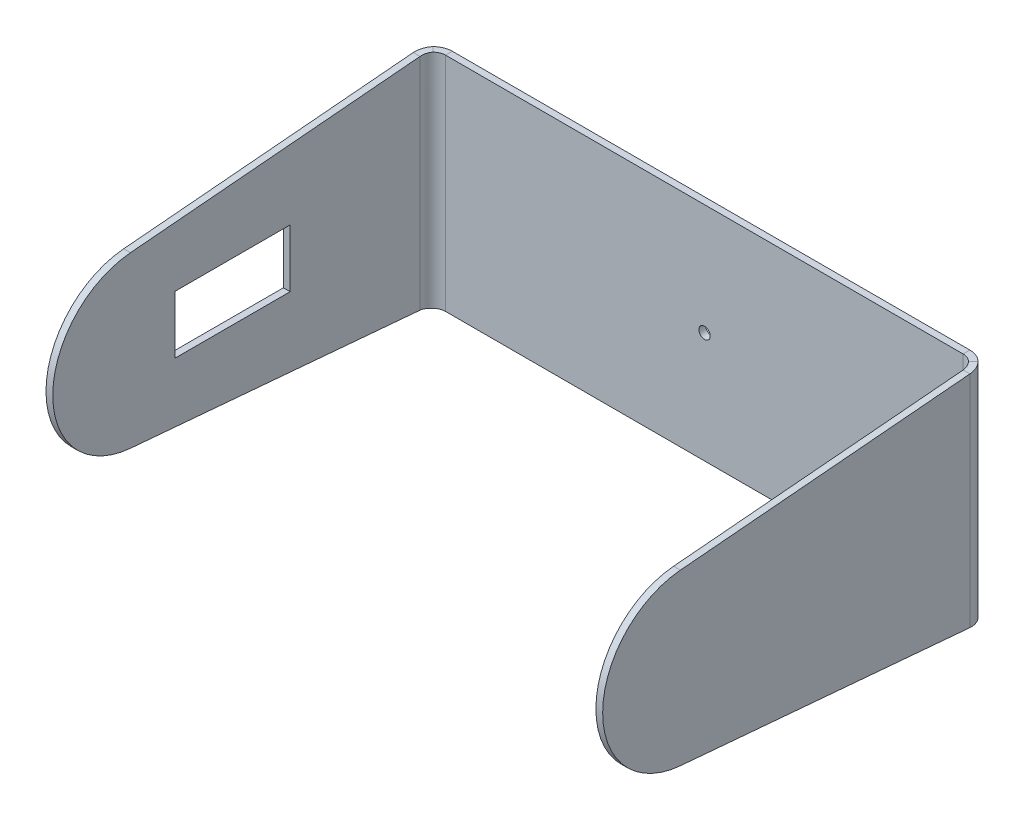
ISO-10303-21;
HEADER;
FILE_DESCRIPTION(('STEP AP214'),'2;1');
FILE_NAME('part.step','',(''),(''),'','','');
FILE_SCHEMA(('AUTOMOTIVE_DESIGN { 1 0 10303 214 1 1 1 1 }'));
ENDSEC;
DATA;
#1=APPLICATION_CONTEXT('core data for automotive mechanical design processes');
#2=APPLICATION_PROTOCOL_DEFINITION('international standard','automotive_design',2000,#1);
#3=PRODUCT_CONTEXT('',#1,'mechanical');
#4=PRODUCT('Part','Part','',(#3));
#5=PRODUCT_RELATED_PRODUCT_CATEGORY('part','',(#4));
#6=PRODUCT_DEFINITION_FORMATION('','',#4);
#7=PRODUCT_DEFINITION_CONTEXT('part definition',#1,'design');
#8=PRODUCT_DEFINITION('design','',#6,#7);
#9=PRODUCT_DEFINITION_SHAPE('','',#8);
#10=(LENGTH_UNIT() NAMED_UNIT(*) SI_UNIT(.MILLI.,.METRE.));
#11=(NAMED_UNIT(*) PLANE_ANGLE_UNIT() SI_UNIT($,.RADIAN.));
#12=(NAMED_UNIT(*) SI_UNIT($,.STERADIAN.) SOLID_ANGLE_UNIT());
#13=UNCERTAINTY_MEASURE_WITH_UNIT(LENGTH_MEASURE(1.E-05),#10,'distance_accuracy_value','');
#14=(GEOMETRIC_REPRESENTATION_CONTEXT(3) GLOBAL_UNCERTAINTY_ASSIGNED_CONTEXT((#13)) GLOBAL_UNIT_ASSIGNED_CONTEXT((#10,
#11,#12)) REPRESENTATION_CONTEXT('',''));
#15=CARTESIAN_POINT('',(0.,0.,0.));
#16=DIRECTION('',(0.,0.,1.));
#17=DIRECTION('',(1.,0.,0.));
#18=AXIS2_PLACEMENT_3D('',#15,#16,#17);
#19=CARTESIAN_POINT('',(-40.82194116274,0.,1.3462));
#20=DIRECTION('',(0.,-1.,0.));
#21=DIRECTION('',(1.,0.,0.));
#22=AXIS2_PLACEMENT_3D('',#19,#20,#21);
#23=PLANE('',#22);
#24=DIRECTION('',(1.,0.,0.));
#25=VECTOR('',#24,1.);
#26=CARTESIAN_POINT('',(125.762192998747,0.,0.));
#27=LINE('',#26,#25);
#28=CARTESIAN_POINT('',(-38.2983783239276,0.,0.));
#29=VERTEX_POINT('',#28);
#30=CARTESIAN_POINT('',(64.6044959984477,0.,0.));
#31=VERTEX_POINT('',#30);
#32=EDGE_CURVE('E97',#29,#31,#27,.T.);
#33=ORIENTED_EDGE('',*,*,#32,.T.);
#34=DIRECTION('',(0.,0.,1.));
#35=VECTOR('',#34,1.);
#36=CARTESIAN_POINT('',(64.6044959984477,0.,1.3462));
#37=LINE('',#36,#35);
#38=CARTESIAN_POINT('',(64.6044959984477,0.,1.3462));
#39=VERTEX_POINT('',#38);
#40=EDGE_CURVE('E822',#31,#39,#37,.T.);
#41=ORIENTED_EDGE('',*,*,#40,.T.);
#42=DIRECTION('',(1.,0.,0.));
#43=VECTOR('',#42,1.);
#44=CARTESIAN_POINT('',(-40.82194116274,0.,1.3462));
#45=LINE('',#44,#43);
#46=CARTESIAN_POINT('',(-38.2983783239276,0.,1.3462));
#47=VERTEX_POINT('',#46);
#48=EDGE_CURVE('E748',#47,#39,#45,.T.);
#49=ORIENTED_EDGE('',*,*,#48,.F.);
#50=DIRECTION('',(0.,0.,1.));
#51=VECTOR('',#50,1.);
#52=CARTESIAN_POINT('',(-38.2983783239276,0.,1.3462));
#53=LINE('',#52,#51);
#54=EDGE_CURVE('E673',#29,#47,#53,.T.);
#55=ORIENTED_EDGE('',*,*,#54,.F.);
#56=EDGE_LOOP('',(#33,#41,#49,#55));
#57=FACE_BOUND('',#56,.T.);
#58=ADVANCED_FACE('F70',(#57),#23,.T.);
#59=CARTESIAN_POINT('',(67.1280588372601,44.1331519853289,1.3462));
#60=DIRECTION('',(0.,1.,0.));
#61=DIRECTION('',(-1.,0.,0.));
#62=AXIS2_PLACEMENT_3D('',#59,#60,#61);
#63=PLANE('',#62);
#64=DIRECTION('',(-1.,0.,0.));
#65=VECTOR('',#64,1.);
#66=CARTESIAN_POINT('',(67.1280588372601,44.1331519853289,1.3462));
#67=LINE('',#66,#65);
#68=CARTESIAN_POINT('',(64.6044959984477,44.1331519853289,1.3462));
#69=VERTEX_POINT('',#68);
#70=CARTESIAN_POINT('',(-38.2983783239276,44.1331519853289,1.3462));
#71=VERTEX_POINT('',#70);
#72=EDGE_CURVE('E751',#69,#71,#67,.T.);
#73=ORIENTED_EDGE('',*,*,#72,.F.);
#74=DIRECTION('',(0.,0.,-1.));
#75=VECTOR('',#74,1.);
#76=CARTESIAN_POINT('',(64.6044959984477,44.1331519853289,1.3462));
#77=LINE('',#76,#75);
#78=CARTESIAN_POINT('',(64.6044959984477,44.1331519853289,0.));
#79=VERTEX_POINT('',#78);
#80=EDGE_CURVE('E12',#69,#79,#77,.T.);
#81=ORIENTED_EDGE('',*,*,#80,.T.);
#82=DIRECTION('',(1.,0.,0.));
#83=VECTOR('',#82,1.);
#84=CARTESIAN_POINT('',(125.762192998747,44.1331519853289,0.));
#85=LINE('',#84,#83);
#86=CARTESIAN_POINT('',(-38.2983783239276,44.1331519853289,0.));
#87=VERTEX_POINT('',#86);
#88=EDGE_CURVE('E749',#79,#87,#85,.F.);
#89=ORIENTED_EDGE('',*,*,#88,.T.);
#90=DIRECTION('',(0.,0.,-1.));
#91=VECTOR('',#90,1.);
#92=CARTESIAN_POINT('',(-38.2983783239276,44.1331519853289,1.3462));
#93=LINE('',#92,#91);
#94=EDGE_CURVE('E670',#71,#87,#93,.T.);
#95=ORIENTED_EDGE('',*,*,#94,.F.);
#96=EDGE_LOOP('',(#73,#81,#89,#95));
#97=FACE_BOUND('',#96,.T.);
#98=ADVANCED_FACE('F808',(#97),#63,.T.);
#99=CARTESIAN_POINT('',(125.762192998747,22.0665759926644,1.3462));
#100=DIRECTION('',(0.,0.,1.));
#101=DIRECTION('',(1.,0.,0.));
#102=AXIS2_PLACEMENT_3D('',#99,#100,#101);
#103=PLANE('',#102);
#104=CARTESIAN_POINT('',(13.1919740673823,22.0665759926644,1.3462));
#105=DIRECTION('',(0.,0.,1.));
#106=DIRECTION('',(1.,0.,0.));
#107=AXIS2_PLACEMENT_3D('',#104,#105,#106);
#108=CIRCLE('',#107,1.13402350588102);
#109=CARTESIAN_POINT('',(14.3259975732633,22.0665759926644,1.3462));
#110=VERTEX_POINT('',#109);
#111=EDGE_CURVE('E744',#110,#110,#108,.T.);
#112=ORIENTED_EDGE('',*,*,#111,.F.);
#113=EDGE_LOOP('',(#112));
#114=FACE_BOUND('',#113,.T.);
#115=ORIENTED_EDGE('',*,*,#48,.T.);
#116=DIRECTION('',(0.,1.,0.));
#117=VECTOR('',#116,1.);
#118=CARTESIAN_POINT('',(64.6044959984477,22.0665759926645,1.3462));
#119=LINE('',#118,#117);
#120=EDGE_CURVE('E473',#39,#69,#119,.T.);
#121=ORIENTED_EDGE('',*,*,#120,.T.);
#122=ORIENTED_EDGE('',*,*,#72,.T.);
#123=DIRECTION('',(0.,1.,0.));
#124=VECTOR('',#123,1.);
#125=CARTESIAN_POINT('',(-38.2983783239276,22.0665759926645,1.3462));
#126=LINE('',#125,#124);
#127=EDGE_CURVE('E742',#47,#71,#126,.T.);
#128=ORIENTED_EDGE('',*,*,#127,.F.);
#129=EDGE_LOOP('',(#115,#121,#122,#128));
#130=FACE_BOUND('',#129,.T.);
#131=ADVANCED_FACE('F813',(#114,#130),#103,.T.);
#132=CARTESIAN_POINT('',(125.762192998747,22.0665759926644,0.));
#133=DIRECTION('',(0.,0.,1.));
#134=DIRECTION('',(1.,0.,0.));
#135=AXIS2_PLACEMENT_3D('',#132,#133,#134);
#136=PLANE('',#135);
#137=DIRECTION('',(0.,1.,0.));
#138=VECTOR('',#137,1.);
#139=CARTESIAN_POINT('',(64.6044959984477,22.0665759926645,0.));
#140=LINE('',#139,#138);
#141=EDGE_CURVE('E81',#31,#79,#140,.T.);
#142=ORIENTED_EDGE('',*,*,#141,.F.);
#143=ORIENTED_EDGE('',*,*,#32,.F.);
#144=DIRECTION('',(0.,1.,0.));
#145=VECTOR('',#144,1.);
#146=CARTESIAN_POINT('',(-38.2983783239276,22.0665759926645,0.));
#147=LINE('',#146,#145);
#148=EDGE_CURVE('E671',#29,#87,#147,.T.);
#149=ORIENTED_EDGE('',*,*,#148,.T.);
#150=ORIENTED_EDGE('',*,*,#88,.F.);
#151=EDGE_LOOP('',(#142,#143,#149,#150));
#152=FACE_BOUND('',#151,.T.);
#153=CARTESIAN_POINT('',(13.1919740673823,22.0665759926644,0.));
#154=DIRECTION('',(0.,0.,1.));
#155=DIRECTION('',(1.,0.,0.));
#156=AXIS2_PLACEMENT_3D('',#153,#154,#155);
#157=CIRCLE('',#156,1.13402350588102);
#158=CARTESIAN_POINT('',(14.3259975732633,22.0665759926644,0.));
#159=VERTEX_POINT('',#158);
#160=EDGE_CURVE('E745',#159,#159,#157,.T.);
#161=ORIENTED_EDGE('',*,*,#160,.T.);
#162=EDGE_LOOP('',(#161));
#163=FACE_BOUND('',#162,.T.);
#164=ADVANCED_FACE('F72',(#152,#163),#136,.F.);
#165=CARTESIAN_POINT('',(13.1919740673823,22.0665759926644,1.3462));
#166=DIRECTION('',(0.,0.,1.));
#167=DIRECTION('',(1.,0.,0.));
#168=AXIS2_PLACEMENT_3D('',#165,#166,#167);
#169=CYLINDRICAL_SURFACE('',#168,1.13402350588102);
#170=ORIENTED_EDGE('',*,*,#111,.T.);
#171=EDGE_LOOP('',(#170));
#172=FACE_BOUND('',#171,.T.);
#173=ORIENTED_EDGE('',*,*,#160,.F.);
#174=EDGE_LOOP('',(#173));
#175=FACE_BOUND('',#174,.T.);
#176=ADVANCED_FACE('F567',(#172,#175),#169,.F.);
#177=CARTESIAN_POINT('',(-42.1845783239276,0.219391616614232,3.88620000000002));
#178=CARTESIAN_POINT('',(-42.1845783239276,0.18281978844676,3.37740636334999));
#179=CARTESIAN_POINT('',(-42.083430939996,0.146261077742817,2.86899537180298));
#180=CARTESIAN_POINT('',(-41.6940869863499,0.0731305388714022,1.92903591848262));
#181=CARTESIAN_POINT('',(-41.4061081276746,0.0365718281674734,1.49801305765265));
#182=CARTESIAN_POINT('',(-41.0463366969748,0.,1.13824162695285));
#183=CARTESIAN_POINT('',(-40.8383783239276,0.219391616614232,3.88620000000001));
#184=CARTESIAN_POINT('',(-40.8383783239276,0.1828198333425,3.553655547678));
#185=CARTESIAN_POINT('',(-40.7722689226651,0.146261077742817,3.22136037372744));
#186=CARTESIAN_POINT('',(-40.5177957503474,0.0731305388714022,2.60700778985792));
#187=CARTESIAN_POINT('',(-40.3295739854243,0.0365717832717318,2.32529321306903));
#188=CARTESIAN_POINT('',(-40.0944295481414,0.,2.09014877578618));
#189=B_SPLINE_SURFACE_WITH_KNOTS('',1,3,((#177,#178,#179,#180,#181,#182),(#183,#184,#185,#186,
#187,#188)),.UNSPECIFIED.,.F.,.F.,.F.,(2,2),(4,2,4),(0.,1.),(0.,0.5,1.),.UNSPECIFIED.);
#190=CARTESIAN_POINT('',(-40.8383783239276,0.219391616614232,3.88620000000001));
#191=CARTESIAN_POINT('',(-42.1845783239276,0.219391616614232,3.88620000000002));
#192=B_SPLINE_CURVE_WITH_KNOTS('',1,(#190,#191),.UNSPECIFIED.,.F.,.F.,(2,2),(0.,1.),.UNSPECIFIED.);
#193=CARTESIAN_POINT('',(-42.1845783239276,0.219391616614234,3.88620000000002));
#194=VERTEX_POINT('',#193);
#195=CARTESIAN_POINT('',(-40.8383783239276,0.219391616614232,3.88620000000001));
#196=VERTEX_POINT('',#195);
#197=EDGE_CURVE('E462',#194,#196,#192,.F.);
#198=CARTESIAN_POINT('',(-42.1845783239276,0.219391616614232,3.88620000000002));
#199=CARTESIAN_POINT('',(-42.1845783239276,0.18281978844676,3.37740636334999));
#200=CARTESIAN_POINT('',(-42.083430939996,0.146261077742817,2.86899537180298));
#201=CARTESIAN_POINT('',(-41.6940869863499,0.0731305388714022,1.92903591848262));
#202=CARTESIAN_POINT('',(-41.4061081276746,0.0365718281674734,1.49801305765265));
#203=CARTESIAN_POINT('',(-41.0463366969748,0.,1.13824162695285));
#204=B_SPLINE_CURVE_WITH_KNOTS('',3,(#198,#199,#200,#201,#202,#203),.UNSPECIFIED.,.F.,.F.,(4,2,
4),(0.,0.5,1.),.UNSPECIFIED.);
#205=CARTESIAN_POINT('',(-41.0463366969748,0.,1.13824162695285));
#206=VERTEX_POINT('',#205);
#207=EDGE_CURVE('E632',#194,#206,#204,.T.);
#208=CARTESIAN_POINT('',(-41.0463366969748,0.,1.13824162695285));
#209=CARTESIAN_POINT('',(-40.0944295481414,0.,2.09014877578618));
#210=B_SPLINE_CURVE_WITH_KNOTS('',1,(#208,#209),.UNSPECIFIED.,.F.,.F.,(2,2),(0.,1.),.UNSPECIFIED.);
#211=CARTESIAN_POINT('',(-40.0944295481414,0.,2.09014877578618));
#212=VERTEX_POINT('',#211);
#213=EDGE_CURVE('E667',#206,#212,#210,.T.);
#214=CARTESIAN_POINT('',(-40.0944295481414,0.,2.09014877578618));
#215=CARTESIAN_POINT('',(-40.3295739854243,0.0365717832717318,2.32529321306903));
#216=CARTESIAN_POINT('',(-40.5177957503474,0.0731305388714022,2.60700778985792));
#217=CARTESIAN_POINT('',(-40.7722689226651,0.146261077742817,3.22136037372744));
#218=CARTESIAN_POINT('',(-40.8383783239276,0.1828198333425,3.553655547678));
#219=CARTESIAN_POINT('',(-40.8383783239276,0.219391616614232,3.88620000000001));
#220=B_SPLINE_CURVE_WITH_KNOTS('',3,(#214,#215,#216,#217,#218,#219),.UNSPECIFIED.,.F.,.F.,(4,2,
4),(0.,0.5,1.),.UNSPECIFIED.);
#221=EDGE_CURVE('E634',#196,#212,#220,.F.);
#222=ORIENTED_EDGE('',*,*,#197,.F.);
#223=ORIENTED_EDGE('',*,*,#207,.T.);
#224=ORIENTED_EDGE('',*,*,#213,.T.);
#225=ORIENTED_EDGE('',*,*,#221,.F.);
#226=EDGE_LOOP('',(#222,#223,#224,#225));
#227=FACE_BOUND('',#226,.T.);
#228=ADVANCED_FACE('F562',(#227),#189,.F.);
#229=CARTESIAN_POINT('',(-38.2983783239276,0.,3.8862));
#230=DIRECTION('',(0.,1.,0.));
#231=DIRECTION('',(-1.,0.,0.));
#232=AXIS2_PLACEMENT_3D('',#229,#230,#231);
#233=PLANE('',#232);
#234=ORIENTED_EDGE('',*,*,#213,.F.);
#235=CARTESIAN_POINT('',(-38.2983783239276,0.,3.8862));
#236=DIRECTION('',(0.,-1.,0.));
#237=DIRECTION('',(1.,0.,0.));
#238=AXIS2_PLACEMENT_3D('',#235,#236,#237);
#239=CIRCLE('',#238,3.8862);
#240=EDGE_CURVE('E540',#206,#29,#239,.T.);
#241=ORIENTED_EDGE('',*,*,#240,.T.);
#242=ORIENTED_EDGE('',*,*,#54,.T.);
#243=CARTESIAN_POINT('',(-38.2983783239276,0.,3.8862));
#244=DIRECTION('',(0.,-1.,0.));
#245=DIRECTION('',(1.,0.,0.));
#246=AXIS2_PLACEMENT_3D('',#243,#244,#245);
#247=CIRCLE('',#246,2.54);
#248=EDGE_CURVE('E520',#212,#47,#247,.T.);
#249=ORIENTED_EDGE('',*,*,#248,.F.);
#250=EDGE_LOOP('',(#234,#241,#242,#249));
#251=FACE_BOUND('',#250,.T.);
#252=ADVANCED_FACE('F606',(#251),#233,.F.);
#253=CARTESIAN_POINT('',(-38.2983783239276,44.1331519853289,3.8862));
#254=DIRECTION('',(0.,-1.,0.));
#255=DIRECTION('',(0.,0.,-1.));
#256=AXIS2_PLACEMENT_3D('',#253,#254,#255);
#257=PLANE('',#256);
#258=ORIENTED_EDGE('',*,*,#94,.T.);
#259=CARTESIAN_POINT('',(-38.2983783239276,44.1331519853289,3.8862));
#260=DIRECTION('',(0.,-1.,0.));
#261=DIRECTION('',(1.,0.,0.));
#262=AXIS2_PLACEMENT_3D('',#259,#260,#261);
#263=CIRCLE('',#262,3.8862);
#264=CARTESIAN_POINT('',(-41.0463366969748,44.1331519853289,1.13824162695284));
#265=VERTEX_POINT('',#264);
#266=EDGE_CURVE('E532',#87,#265,#263,.F.);
#267=ORIENTED_EDGE('',*,*,#266,.T.);
#268=CARTESIAN_POINT('',(-40.0944295481414,44.1331519853289,2.09014877578618));
#269=CARTESIAN_POINT('',(-41.0463366969748,44.1331519853289,1.13824162695286));
#270=B_SPLINE_CURVE_WITH_KNOTS('',1,(#268,#269),.UNSPECIFIED.,.F.,.F.,(2,2),(0.,1.),.UNSPECIFIED.);
#271=CARTESIAN_POINT('',(-40.0944295481414,44.1331519853289,2.09014877578617));
#272=VERTEX_POINT('',#271);
#273=EDGE_CURVE('E595',#265,#272,#270,.F.);
#274=ORIENTED_EDGE('',*,*,#273,.T.);
#275=CARTESIAN_POINT('',(-38.2983783239276,44.1331519853289,3.8862));
#276=DIRECTION('',(0.,1.,0.));
#277=DIRECTION('',(0.,0.,1.));
#278=AXIS2_PLACEMENT_3D('',#275,#276,#277);
#279=CIRCLE('',#278,2.54);
#280=EDGE_CURVE('E518',#71,#272,#279,.T.);
#281=ORIENTED_EDGE('',*,*,#280,.F.);
#282=EDGE_LOOP('',(#258,#267,#274,#281));
#283=FACE_BOUND('',#282,.T.);
#284=ADVANCED_FACE('F561',(#283),#257,.F.);
#285=CARTESIAN_POINT('',(-41.0463366969748,44.1331519853289,1.13824162695286));
#286=CARTESIAN_POINT('',(-41.4061081276746,44.0965801571614,1.49801305765268));
#287=CARTESIAN_POINT('',(-41.6940869863499,44.0600214464575,1.92903591848264));
#288=CARTESIAN_POINT('',(-42.083430939996,43.986890907586,2.86899537180299));
#289=CARTESIAN_POINT('',(-42.1845783239276,43.9503321968821,3.37740636334999));
#290=CARTESIAN_POINT('',(-42.1845783239276,43.9137603687146,3.88620000000003));
#291=CARTESIAN_POINT('',(-40.0944295481414,44.1331519853289,2.09014877578618));
#292=CARTESIAN_POINT('',(-40.3295739854243,44.0965802020571,2.32529321306905));
#293=CARTESIAN_POINT('',(-40.5177957503474,44.0600214464575,2.60700778985793));
#294=CARTESIAN_POINT('',(-40.7722689226651,43.986890907586,3.22136037372745));
#295=CARTESIAN_POINT('',(-40.8383783239276,43.9503321519864,3.553655547678));
#296=CARTESIAN_POINT('',(-40.8383783239276,43.9137603687146,3.88620000000002));
#297=B_SPLINE_SURFACE_WITH_KNOTS('',1,3,((#285,#286,#287,#288,#289,#290),(#291,#292,#293,#294,
#295,#296)),.UNSPECIFIED.,.F.,.F.,.F.,(2,2),(4,2,4),(0.,1.),(0.,0.5,1.),.UNSPECIFIED.);
#298=CARTESIAN_POINT('',(-41.0463366969748,44.1331519853289,1.13824162695286));
#299=CARTESIAN_POINT('',(-41.4061081276746,44.0965801571614,1.49801305765268));
#300=CARTESIAN_POINT('',(-41.6940869863499,44.0600214464575,1.92903591848264));
#301=CARTESIAN_POINT('',(-42.083430939996,43.986890907586,2.86899537180299));
#302=CARTESIAN_POINT('',(-42.1845783239276,43.9503321968821,3.37740636334999));
#303=CARTESIAN_POINT('',(-42.1845783239276,43.9137603687146,3.88620000000003));
#304=B_SPLINE_CURVE_WITH_KNOTS('',3,(#298,#299,#300,#301,#302,#303),.UNSPECIFIED.,.F.,.F.,(4,2,
4),(0.,0.5,1.),.UNSPECIFIED.);
#305=CARTESIAN_POINT('',(-42.1845783239276,43.9137603687146,3.88620000000001));
#306=VERTEX_POINT('',#305);
#307=EDGE_CURVE('E528',#265,#306,#304,.T.);
#308=CARTESIAN_POINT('',(-42.1845783239276,43.9137603687146,3.88620000000003));
#309=CARTESIAN_POINT('',(-40.8383783239276,43.9137603687146,3.88620000000002));
#310=B_SPLINE_CURVE_WITH_KNOTS('',1,(#308,#309),.UNSPECIFIED.,.F.,.F.,(2,2),(0.,1.),.UNSPECIFIED.);
#311=CARTESIAN_POINT('',(-40.8383783239276,43.9137603687146,3.88620000000001));
#312=VERTEX_POINT('',#311);
#313=EDGE_CURVE('E457',#312,#306,#310,.F.);
#314=CARTESIAN_POINT('',(-40.8383783239276,43.9137603687146,3.88620000000002));
#315=CARTESIAN_POINT('',(-40.8383783239276,43.9503321519864,3.553655547678));
#316=CARTESIAN_POINT('',(-40.7722689226651,43.986890907586,3.22136037372745));
#317=CARTESIAN_POINT('',(-40.5177957503474,44.0600214464575,2.60700778985793));
#318=CARTESIAN_POINT('',(-40.3295739854243,44.0965802020571,2.32529321306905));
#319=CARTESIAN_POINT('',(-40.0944295481414,44.1331519853289,2.09014877578618));
#320=B_SPLINE_CURVE_WITH_KNOTS('',3,(#314,#315,#316,#317,#318,#319),.UNSPECIFIED.,.F.,.F.,(4,2,
4),(0.,0.5,1.),.UNSPECIFIED.);
#321=EDGE_CURVE('E517',#272,#312,#320,.F.);
#322=ORIENTED_EDGE('',*,*,#307,.T.);
#323=ORIENTED_EDGE('',*,*,#313,.F.);
#324=ORIENTED_EDGE('',*,*,#321,.F.);
#325=ORIENTED_EDGE('',*,*,#273,.F.);
#326=EDGE_LOOP('',(#322,#323,#324,#325));
#327=FACE_BOUND('',#326,.T.);
#328=ADVANCED_FACE('F488',(#327),#297,.F.);
#329=CARTESIAN_POINT('',(-38.2983783239276,66.5077825042554,3.8862));
#330=DIRECTION('',(0.,-1.,0.));
#331=DIRECTION('',(1.,0.,0.));
#332=AXIS2_PLACEMENT_3D('',#329,#330,#331);
#333=CYLINDRICAL_SURFACE('',#332,2.54);
#334=ORIENTED_EDGE('',*,*,#280,.T.);
#335=ORIENTED_EDGE('',*,*,#321,.T.);
#336=DIRECTION('',(0.,1.,0.));
#337=VECTOR('',#336,1.);
#338=CARTESIAN_POINT('',(-40.8383783239276,22.0665759926645,3.88620000000001));
#339=LINE('',#338,#337);
#340=EDGE_CURVE('E728',#196,#312,#339,.T.);
#341=ORIENTED_EDGE('',*,*,#340,.F.);
#342=ORIENTED_EDGE('',*,*,#221,.T.);
#343=ORIENTED_EDGE('',*,*,#248,.T.);
#344=ORIENTED_EDGE('',*,*,#127,.T.);
#345=EDGE_LOOP('',(#334,#335,#341,#342,#343,#344));
#346=FACE_BOUND('',#345,.T.);
#347=ADVANCED_FACE('F484',(#346),#333,.F.);
#348=CARTESIAN_POINT('',(-38.2983783239276,66.5077825042554,3.8862));
#349=DIRECTION('',(0.,-1.,0.));
#350=DIRECTION('',(1.,0.,0.));
#351=AXIS2_PLACEMENT_3D('',#348,#349,#350);
#352=CYLINDRICAL_SURFACE('',#351,3.8862);
#353=ORIENTED_EDGE('',*,*,#266,.F.);
#354=ORIENTED_EDGE('',*,*,#148,.F.);
#355=ORIENTED_EDGE('',*,*,#240,.F.);
#356=ORIENTED_EDGE('',*,*,#207,.F.);
#357=DIRECTION('',(0.,1.,0.));
#358=VECTOR('',#357,1.);
#359=CARTESIAN_POINT('',(-42.1845783239276,22.0665759926645,3.88620000000002));
#360=LINE('',#359,#358);
#361=EDGE_CURVE('E443',#194,#306,#360,.T.);
#362=ORIENTED_EDGE('',*,*,#361,.T.);
#363=ORIENTED_EDGE('',*,*,#307,.F.);
#364=EDGE_LOOP('',(#353,#354,#355,#356,#362,#363));
#365=FACE_BOUND('',#364,.T.);
#366=ADVANCED_FACE('F408',(#365),#352,.T.);
#367=CARTESIAN_POINT('',(-40.8383783239274,22.0665759926644,59.9967713226751));
#368=DIRECTION('',(1.,0.,0.));
#369=DIRECTION('',(0.,0.,-1.));
#370=AXIS2_PLACEMENT_3D('',#367,#368,#369);
#371=CYLINDRICAL_SURFACE('',#370,16.9053198700096);
#372=DIRECTION('',(1.,0.,0.));
#373=VECTOR('',#372,1.);
#374=CARTESIAN_POINT('',(-40.8383783239274,38.9083698103987,61.4609505836502));
#375=LINE('',#374,#373);
#376=CARTESIAN_POINT('',(-42.1845783239274,38.9083698103987,61.4609505836502));
#377=VERTEX_POINT('',#376);
#378=CARTESIAN_POINT('',(-40.8383783239274,38.9083698103987,61.4609505836502));
#379=VERTEX_POINT('',#378);
#380=EDGE_CURVE('E456',#377,#379,#375,.T.);
#381=ORIENTED_EDGE('',*,*,#380,.F.);
#382=CARTESIAN_POINT('',(-42.1845783239274,22.0665759926644,59.9967713226751));
#383=DIRECTION('',(1.,0.,0.));
#384=DIRECTION('',(0.,0.,-1.));
#385=AXIS2_PLACEMENT_3D('',#382,#383,#384);
#386=CIRCLE('',#385,16.9053198700096);
#387=CARTESIAN_POINT('',(-42.1845783239274,5.22478217493017,61.4609505836502));
#388=VERTEX_POINT('',#387);
#389=EDGE_CURVE('E451',#377,#388,#386,.T.);
#390=ORIENTED_EDGE('',*,*,#389,.T.);
#391=DIRECTION('',(1.,0.,0.));
#392=VECTOR('',#391,1.);
#393=CARTESIAN_POINT('',(-40.8383783239274,5.22478217493017,61.4609505836502));
#394=LINE('',#393,#392);
#395=CARTESIAN_POINT('',(-40.8383783239274,5.22478217493017,61.4609505836502));
#396=VERTEX_POINT('',#395);
#397=EDGE_CURVE('E681',#388,#396,#394,.T.);
#398=ORIENTED_EDGE('',*,*,#397,.T.);
#399=CARTESIAN_POINT('',(-40.8383783239274,22.0665759926644,59.9967713226751));
#400=DIRECTION('',(1.,0.,0.));
#401=DIRECTION('',(0.,0.,-1.));
#402=AXIS2_PLACEMENT_3D('',#399,#400,#401);
#403=CIRCLE('',#402,16.9053198700096);
#404=EDGE_CURVE('E704',#379,#396,#403,.T.);
#405=ORIENTED_EDGE('',*,*,#404,.F.);
#406=EDGE_LOOP('',(#381,#390,#398,#405));
#407=FACE_BOUND('',#406,.T.);
#408=ADVANCED_FACE('F404',(#407),#371,.T.);
#409=CARTESIAN_POINT('',(-40.8383783239274,16.3134759926644,52.5594085617072));
#410=DIRECTION('',(0.,-1.,0.));
#411=DIRECTION('',(0.,0.,-1.));
#412=AXIS2_PLACEMENT_3D('',#409,#410,#411);
#413=PLANE('',#412);
#414=DIRECTION('',(1.,0.,0.));
#415=VECTOR('',#414,1.);
#416=CARTESIAN_POINT('',(-40.8383783239275,16.3134759926644,29.6994085617072));
#417=LINE('',#416,#415);
#418=CARTESIAN_POINT('',(-42.1845783239275,16.3134759926644,29.6994085617072));
#419=VERTEX_POINT('',#418);
#420=CARTESIAN_POINT('',(-40.8383783239275,16.3134759926644,29.6994085617072));
#421=VERTEX_POINT('',#420);
#422=EDGE_CURVE('E688',#419,#421,#417,.T.);
#423=ORIENTED_EDGE('',*,*,#422,.F.);
#424=DIRECTION('',(0.,0.,-1.));
#425=VECTOR('',#424,1.);
#426=CARTESIAN_POINT('',(-42.1845783239282,16.3134759926645,-165.2214970003));
#427=LINE('',#426,#425);
#428=CARTESIAN_POINT('',(-42.1845783239274,16.3134759926644,52.5594085617072));
#429=VERTEX_POINT('',#428);
#430=EDGE_CURVE('E713',#429,#419,#427,.T.);
#431=ORIENTED_EDGE('',*,*,#430,.F.);
#432=DIRECTION('',(1.,0.,0.));
#433=VECTOR('',#432,1.);
#434=CARTESIAN_POINT('',(-40.8383783239274,16.3134759926644,52.5594085617072));
#435=LINE('',#434,#433);
#436=CARTESIAN_POINT('',(-40.8383783239274,16.3134759926644,52.5594085617072));
#437=VERTEX_POINT('',#436);
#438=EDGE_CURVE('E683',#429,#437,#435,.T.);
#439=ORIENTED_EDGE('',*,*,#438,.T.);
#440=DIRECTION('',(0.,0.,-1.));
#441=VECTOR('',#440,1.);
#442=CARTESIAN_POINT('',(-40.8383783239274,16.3134759926644,52.5594085617072));
#443=LINE('',#442,#441);
#444=EDGE_CURVE('E685',#437,#421,#443,.T.);
#445=ORIENTED_EDGE('',*,*,#444,.T.);
#446=EDGE_LOOP('',(#423,#431,#439,#445));
#447=FACE_BOUND('',#446,.T.);
#448=ADVANCED_FACE('F407',(#447),#413,.F.);
#449=CARTESIAN_POINT('',(-40.8383783239275,16.3134759926644,29.6994085617072));
#450=DIRECTION('',(0.,0.,-1.));
#451=DIRECTION('',(0.,1.,0.));
#452=AXIS2_PLACEMENT_3D('',#449,#450,#451);
#453=PLANE('',#452);
#454=DIRECTION('',(1.,0.,0.));
#455=VECTOR('',#454,1.);
#456=CARTESIAN_POINT('',(-40.8383783239275,27.8196759926644,29.6994085617072));
#457=LINE('',#456,#455);
#458=CARTESIAN_POINT('',(-42.1845783239275,27.8196759926644,29.6994085617072));
#459=VERTEX_POINT('',#458);
#460=CARTESIAN_POINT('',(-40.8383783239275,27.8196759926644,29.6994085617072));
#461=VERTEX_POINT('',#460);
#462=EDGE_CURVE('E693',#459,#461,#457,.T.);
#463=ORIENTED_EDGE('',*,*,#462,.F.);
#464=DIRECTION('',(0.,1.,0.));
#465=VECTOR('',#464,1.);
#466=CARTESIAN_POINT('',(-42.1845783239275,22.0665759926644,29.6994085617072));
#467=LINE('',#466,#465);
#468=EDGE_CURVE('E715',#419,#459,#467,.T.);
#469=ORIENTED_EDGE('',*,*,#468,.F.);
#470=ORIENTED_EDGE('',*,*,#422,.T.);
#471=DIRECTION('',(0.,1.,0.));
#472=VECTOR('',#471,1.);
#473=CARTESIAN_POINT('',(-40.8383783239275,16.3134759926644,29.6994085617072));
#474=LINE('',#473,#472);
#475=EDGE_CURVE('E690',#421,#461,#474,.T.);
#476=ORIENTED_EDGE('',*,*,#475,.T.);
#477=EDGE_LOOP('',(#463,#469,#470,#476));
#478=FACE_BOUND('',#477,.T.);
#479=ADVANCED_FACE('F412',(#478),#453,.F.);
#480=CARTESIAN_POINT('',(-40.8383783239275,27.8196759926644,29.6994085617072));
#481=DIRECTION('',(0.,1.,0.));
#482=DIRECTION('',(0.,0.,1.));
#483=AXIS2_PLACEMENT_3D('',#480,#481,#482);
#484=PLANE('',#483);
#485=DIRECTION('',(0.,0.,-1.));
#486=VECTOR('',#485,1.);
#487=CARTESIAN_POINT('',(-42.1845783239282,27.8196759926645,-165.2214970003));
#488=LINE('',#487,#486);
#489=CARTESIAN_POINT('',(-42.1845783239274,27.8196759926644,52.5594085617072));
#490=VERTEX_POINT('',#489);
#491=EDGE_CURVE('E394',#459,#490,#488,.F.);
#492=ORIENTED_EDGE('',*,*,#491,.F.);
#493=ORIENTED_EDGE('',*,*,#462,.T.);
#494=DIRECTION('',(0.,0.,1.));
#495=VECTOR('',#494,1.);
#496=CARTESIAN_POINT('',(-40.8383783239275,27.8196759926644,29.6994085617072));
#497=LINE('',#496,#495);
#498=CARTESIAN_POINT('',(-40.8383783239274,27.8196759926644,52.5594085617072));
#499=VERTEX_POINT('',#498);
#500=EDGE_CURVE('E695',#461,#499,#497,.T.);
#501=ORIENTED_EDGE('',*,*,#500,.T.);
#502=DIRECTION('',(1.,0.,0.));
#503=VECTOR('',#502,1.);
#504=CARTESIAN_POINT('',(-40.8383783239274,27.8196759926644,52.5594085617072));
#505=LINE('',#504,#503);
#506=EDGE_CURVE('E698',#490,#499,#505,.T.);
#507=ORIENTED_EDGE('',*,*,#506,.F.);
#508=EDGE_LOOP('',(#492,#493,#501,#507));
#509=FACE_BOUND('',#508,.T.);
#510=ADVANCED_FACE('F416',(#509),#484,.F.);
#511=CARTESIAN_POINT('',(-40.8383783239274,27.8196759926644,52.5594085617072));
#512=DIRECTION('',(0.,0.,1.));
#513=DIRECTION('',(0.,-1.,0.));
#514=AXIS2_PLACEMENT_3D('',#511,#512,#513);
#515=PLANE('',#514);
#516=ORIENTED_EDGE('',*,*,#438,.F.);
#517=DIRECTION('',(0.,1.,0.));
#518=VECTOR('',#517,1.);
#519=CARTESIAN_POINT('',(-42.1845783239274,22.0665759926644,52.5594085617072));
#520=LINE('',#519,#518);
#521=EDGE_CURVE('E710',#490,#429,#520,.F.);
#522=ORIENTED_EDGE('',*,*,#521,.F.);
#523=ORIENTED_EDGE('',*,*,#506,.T.);
#524=DIRECTION('',(0.,-1.,0.));
#525=VECTOR('',#524,1.);
#526=CARTESIAN_POINT('',(-40.8383783239274,27.8196759926644,52.5594085617072));
#527=LINE('',#526,#525);
#528=EDGE_CURVE('E700',#499,#437,#527,.T.);
#529=ORIENTED_EDGE('',*,*,#528,.T.);
#530=EDGE_LOOP('',(#516,#522,#523,#529));
#531=FACE_BOUND('',#530,.T.);
#532=ADVANCED_FACE('F420',(#531),#515,.F.);
#533=CARTESIAN_POINT('',(-40.8383783239282,22.0665759926645,-165.2214970003));
#534=DIRECTION('',(1.,0.,0.));
#535=DIRECTION('',(0.,0.,-1.));
#536=AXIS2_PLACEMENT_3D('',#533,#534,#535);
#537=PLANE('',#536);
#538=ORIENTED_EDGE('',*,*,#528,.F.);
#539=ORIENTED_EDGE('',*,*,#500,.F.);
#540=ORIENTED_EDGE('',*,*,#475,.F.);
#541=ORIENTED_EDGE('',*,*,#444,.F.);
#542=EDGE_LOOP('',(#538,#539,#540,#541));
#543=FACE_BOUND('',#542,.T.);
#544=DIRECTION('',(0.,-0.0866105623693356,-0.996242244881268));
#545=VECTOR('',#544,1.);
#546=CARTESIAN_POINT('',(-40.8383783239274,5.22478217493017,61.4609505836501));
#547=LINE('',#546,#545);
#548=EDGE_CURVE('E703',#396,#196,#547,.T.);
#549=ORIENTED_EDGE('',*,*,#548,.T.);
#550=ORIENTED_EDGE('',*,*,#340,.T.);
#551=DIRECTION('',(0.,-0.086610562369336,0.996242244881268));
#552=VECTOR('',#551,1.);
#553=CARTESIAN_POINT('',(-40.8383783239276,44.1331519853289,1.36263716118767));
#554=LINE('',#553,#552);
#555=EDGE_CURVE('E707',#312,#379,#554,.T.);
#556=ORIENTED_EDGE('',*,*,#555,.T.);
#557=ORIENTED_EDGE('',*,*,#404,.T.);
#558=EDGE_LOOP('',(#549,#550,#556,#557));
#559=FACE_BOUND('',#558,.T.);
#560=ADVANCED_FACE('F424',(#543,#559),#537,.T.);
#561=CARTESIAN_POINT('',(-40.8383783239276,44.1331519853289,1.36263716118767));
#562=DIRECTION('',(0.,0.996242244881268,0.086610562369336));
#563=DIRECTION('',(0.,-0.086610562369336,0.996242244881268));
#564=AXIS2_PLACEMENT_3D('',#561,#562,#563);
#565=PLANE('',#564);
#566=ORIENTED_EDGE('',*,*,#555,.F.);
#567=ORIENTED_EDGE('',*,*,#313,.T.);
#568=DIRECTION('',(0.,-0.086610562369336,0.996242244881268));
#569=VECTOR('',#568,1.);
#570=CARTESIAN_POINT('',(-42.1845783239276,44.1331519853289,1.36263716118767));
#571=LINE('',#570,#569);
#572=EDGE_CURVE('E454',#306,#377,#571,.T.);
#573=ORIENTED_EDGE('',*,*,#572,.T.);
#574=ORIENTED_EDGE('',*,*,#380,.T.);
#575=EDGE_LOOP('',(#566,#567,#573,#574));
#576=FACE_BOUND('',#575,.T.);
#577=ADVANCED_FACE('F428',(#576),#565,.T.);
#578=CARTESIAN_POINT('',(-42.1845783239282,22.0665759926645,-165.2214970003));
#579=DIRECTION('',(1.,0.,0.));
#580=DIRECTION('',(0.,0.,-1.));
#581=AXIS2_PLACEMENT_3D('',#578,#579,#580);
#582=PLANE('',#581);
#583=ORIENTED_EDGE('',*,*,#361,.F.);
#584=DIRECTION('',(0.,-0.0866105623693356,-0.996242244881268));
#585=VECTOR('',#584,1.);
#586=CARTESIAN_POINT('',(-42.1845783239274,5.22478217493017,61.4609505836501));
#587=LINE('',#586,#585);
#588=EDGE_CURVE('E460',#388,#194,#587,.T.);
#589=ORIENTED_EDGE('',*,*,#588,.F.);
#590=ORIENTED_EDGE('',*,*,#389,.F.);
#591=ORIENTED_EDGE('',*,*,#572,.F.);
#592=EDGE_LOOP('',(#583,#589,#590,#591));
#593=FACE_BOUND('',#592,.T.);
#594=ORIENTED_EDGE('',*,*,#521,.T.);
#595=ORIENTED_EDGE('',*,*,#430,.T.);
#596=ORIENTED_EDGE('',*,*,#468,.T.);
#597=ORIENTED_EDGE('',*,*,#491,.T.);
#598=EDGE_LOOP('',(#594,#595,#596,#597));
#599=FACE_BOUND('',#598,.T.);
#600=ADVANCED_FACE('F433',(#593,#599),#582,.F.);
#601=CARTESIAN_POINT('',(-40.8383783239274,5.22478217493017,61.4609505836501));
#602=DIRECTION('',(0.,-0.996242244881268,0.0866105623693356));
#603=DIRECTION('',(0.,-0.0866105623693356,-0.996242244881268));
#604=AXIS2_PLACEMENT_3D('',#601,#602,#603);
#605=PLANE('',#604);
#606=ORIENTED_EDGE('',*,*,#588,.T.);
#607=ORIENTED_EDGE('',*,*,#197,.T.);
#608=ORIENTED_EDGE('',*,*,#548,.F.);
#609=ORIENTED_EDGE('',*,*,#397,.F.);
#610=EDGE_LOOP('',(#606,#607,#608,#609));
#611=FACE_BOUND('',#610,.T.);
#612=ADVANCED_FACE('F475',(#611),#605,.T.);
#613=CARTESIAN_POINT('',(64.6044959984477,0.,3.8862));
#614=DIRECTION('',(0.,1.,0.));
#615=DIRECTION('',(-1.,0.,0.));
#616=AXIS2_PLACEMENT_3D('',#613,#614,#615);
#617=PLANE('',#616);
#618=ORIENTED_EDGE('',*,*,#40,.F.);
#619=CARTESIAN_POINT('',(64.6044959984477,0.,3.8862));
#620=DIRECTION('',(0.,1.,0.));
#621=DIRECTION('',(-1.,0.,0.));
#622=AXIS2_PLACEMENT_3D('',#619,#620,#621);
#623=CIRCLE('',#622,3.8862);
#624=CARTESIAN_POINT('',(67.3524543714949,0.,1.13824162695284));
#625=VERTEX_POINT('',#624);
#626=EDGE_CURVE('E232',#31,#625,#623,.F.);
#627=ORIENTED_EDGE('',*,*,#626,.T.);
#628=CARTESIAN_POINT('',(66.4005472226615,0.,2.09014877578617));
#629=CARTESIAN_POINT('',(67.3524543714949,0.,1.13824162695285));
#630=B_SPLINE_CURVE_WITH_KNOTS('',1,(#628,#629),.UNSPECIFIED.,.F.,.F.,(2,2),(0.,1.),.UNSPECIFIED.);
#631=CARTESIAN_POINT('',(66.4005472226615,0.,2.09014877578617));
#632=VERTEX_POINT('',#631);
#633=EDGE_CURVE('E359',#625,#632,#630,.F.);
#634=ORIENTED_EDGE('',*,*,#633,.T.);
#635=CARTESIAN_POINT('',(64.6044959984477,0.,3.8862));
#636=DIRECTION('',(0.,-1.,0.));
#637=DIRECTION('',(1.,0.,0.));
#638=AXIS2_PLACEMENT_3D('',#635,#636,#637);
#639=CIRCLE('',#638,2.54);
#640=EDGE_CURVE('E286',#39,#632,#639,.T.);
#641=ORIENTED_EDGE('',*,*,#640,.F.);
#642=EDGE_LOOP('',(#618,#627,#634,#641));
#643=FACE_BOUND('',#642,.T.);
#644=ADVANCED_FACE('F327',(#643),#617,.F.);
#645=CARTESIAN_POINT('',(67.3524543714949,0.,1.13824162695285));
#646=CARTESIAN_POINT('',(67.7122258021947,0.0365718281674744,1.49801305765267));
#647=CARTESIAN_POINT('',(68.00020466087,0.0731305388714114,1.92903591848262));
#648=CARTESIAN_POINT('',(68.3895486145161,0.146261077742824,2.86899537180298));
#649=CARTESIAN_POINT('',(68.4906959984477,0.182819788446763,3.37740636334997));
#650=CARTESIAN_POINT('',(68.4906959984477,0.219391616614237,3.88620000000001));
#651=CARTESIAN_POINT('',(66.4005472226615,0.,2.09014877578617));
#652=CARTESIAN_POINT('',(66.6356916599444,0.0365717832717325,2.32529321306904));
#653=CARTESIAN_POINT('',(66.8239134248675,0.0731305388714113,2.60700778985792));
#654=CARTESIAN_POINT('',(67.0783865971852,0.146261077742824,3.22136037372744));
#655=CARTESIAN_POINT('',(67.1444959984477,0.182819833342503,3.55365554767799));
#656=CARTESIAN_POINT('',(67.1444959984477,0.219391616614237,3.88620000000001));
#657=B_SPLINE_SURFACE_WITH_KNOTS('',1,3,((#645,#646,#647,#648,#649,#650),(#651,#652,#653,#654,
#655,#656)),.UNSPECIFIED.,.F.,.F.,.F.,(2,2),(4,2,4),(0.,1.),(0.,0.5,1.),.UNSPECIFIED.);
#658=CARTESIAN_POINT('',(67.3524543714949,0.,1.13824162695285));
#659=CARTESIAN_POINT('',(67.7122258021947,0.0365718281674744,1.49801305765267));
#660=CARTESIAN_POINT('',(68.00020466087,0.0731305388714114,1.92903591848262));
#661=CARTESIAN_POINT('',(68.3895486145161,0.146261077742824,2.86899537180298));
#662=CARTESIAN_POINT('',(68.4906959984477,0.182819788446763,3.37740636334997));
#663=CARTESIAN_POINT('',(68.4906959984477,0.219391616614237,3.88620000000001));
#664=B_SPLINE_CURVE_WITH_KNOTS('',3,(#658,#659,#660,#661,#662,#663),.UNSPECIFIED.,.F.,.F.,(4,2,
4),(0.,0.5,1.),.UNSPECIFIED.);
#665=CARTESIAN_POINT('',(68.4906959984477,0.219391616614238,3.88620000000002));
#666=VERTEX_POINT('',#665);
#667=EDGE_CURVE('E295',#625,#666,#664,.T.);
#668=CARTESIAN_POINT('',(68.4906959984477,0.219391616614237,3.88620000000001));
#669=CARTESIAN_POINT('',(67.1444959984477,0.219391616614237,3.88620000000001));
#670=B_SPLINE_CURVE_WITH_KNOTS('',1,(#668,#669),.UNSPECIFIED.,.F.,.F.,(2,2),(0.,1.),.UNSPECIFIED.);
#671=CARTESIAN_POINT('',(67.1444959984477,0.21939161661424,3.88620000000002));
#672=VERTEX_POINT('',#671);
#673=EDGE_CURVE('E238',#666,#672,#670,.T.);
#674=CARTESIAN_POINT('',(67.1444959984477,0.219391616614237,3.88620000000001));
#675=CARTESIAN_POINT('',(67.1444959984477,0.182819833342503,3.55365554767799));
#676=CARTESIAN_POINT('',(67.0783865971852,0.146261077742824,3.22136037372744));
#677=CARTESIAN_POINT('',(66.8239134248675,0.0731305388714113,2.60700778985792));
#678=CARTESIAN_POINT('',(66.6356916599444,0.0365717832717325,2.32529321306904));
#679=CARTESIAN_POINT('',(66.4005472226615,0.,2.09014877578617));
#680=B_SPLINE_CURVE_WITH_KNOTS('',3,(#674,#675,#676,#677,#678,#679),.UNSPECIFIED.,.F.,.F.,(4,2,
4),(0.,0.5,1.),.UNSPECIFIED.);
#681=EDGE_CURVE('E285',#632,#672,#680,.F.);
#682=ORIENTED_EDGE('',*,*,#633,.F.);
#683=ORIENTED_EDGE('',*,*,#667,.T.);
#684=ORIENTED_EDGE('',*,*,#673,.T.);
#685=ORIENTED_EDGE('',*,*,#681,.F.);
#686=EDGE_LOOP('',(#682,#683,#684,#685));
#687=FACE_BOUND('',#686,.T.);
#688=ADVANCED_FACE('F315',(#687),#657,.F.);
#689=CARTESIAN_POINT('',(68.4906959984477,43.9137603687146,3.8862));
#690=CARTESIAN_POINT('',(68.4906959984477,43.9503321968821,3.37740636334996));
#691=CARTESIAN_POINT('',(68.3895486145161,43.986890907586,2.86899537180297));
#692=CARTESIAN_POINT('',(68.00020466087,44.0600214464575,1.92903591848261));
#693=CARTESIAN_POINT('',(67.7122258021947,44.0965801571614,1.49801305765267));
#694=CARTESIAN_POINT('',(67.3524543714949,44.1331519853289,1.13824162695285));
#695=CARTESIAN_POINT('',(67.1444959984477,43.9137603687146,3.8862));
#696=CARTESIAN_POINT('',(67.1444959984477,43.9503321519864,3.55365554767798));
#697=CARTESIAN_POINT('',(67.0783865971852,43.986890907586,3.22136037372743));
#698=CARTESIAN_POINT('',(66.8239134248675,44.0600214464575,2.60700778985792));
#699=CARTESIAN_POINT('',(66.6356916599444,44.0965802020571,2.32529321306902));
#700=CARTESIAN_POINT('',(66.4005472226615,44.1331519853289,2.09014877578617));
#701=B_SPLINE_SURFACE_WITH_KNOTS('',1,3,((#689,#690,#691,#692,#693,#694),(#695,#696,#697,#698,
#699,#700)),.UNSPECIFIED.,.F.,.F.,.F.,(2,2),(4,2,4),(0.,1.),(0.,0.5,1.),.UNSPECIFIED.);
#702=CARTESIAN_POINT('',(67.1444959984477,43.9137603687146,3.8862));
#703=CARTESIAN_POINT('',(68.4906959984477,43.9137603687146,3.8862));
#704=B_SPLINE_CURVE_WITH_KNOTS('',1,(#702,#703),.UNSPECIFIED.,.F.,.F.,(2,2),(0.,1.),.UNSPECIFIED.);
#705=CARTESIAN_POINT('',(67.1444959984477,43.9137603687146,3.8862));
#706=VERTEX_POINT('',#705);
#707=CARTESIAN_POINT('',(68.4906959984477,43.9137603687146,3.88619999999999));
#708=VERTEX_POINT('',#707);
#709=EDGE_CURVE('E241',#706,#708,#704,.T.);
#710=CARTESIAN_POINT('',(68.4906959984477,43.9137603687146,3.8862));
#711=CARTESIAN_POINT('',(68.4906959984477,43.9503321968821,3.37740636334996));
#712=CARTESIAN_POINT('',(68.3895486145161,43.986890907586,2.86899537180297));
#713=CARTESIAN_POINT('',(68.00020466087,44.0600214464575,1.92903591848261));
#714=CARTESIAN_POINT('',(67.7122258021947,44.0965801571614,1.49801305765267));
#715=CARTESIAN_POINT('',(67.3524543714949,44.1331519853289,1.13824162695285));
#716=B_SPLINE_CURVE_WITH_KNOTS('',3,(#710,#711,#712,#713,#714,#715),.UNSPECIFIED.,.F.,.F.,(4,2,
4),(0.,0.5,1.),.UNSPECIFIED.);
#717=CARTESIAN_POINT('',(67.3524543714949,44.1331519853289,1.13824162695285));
#718=VERTEX_POINT('',#717);
#719=EDGE_CURVE('E1130',#708,#718,#716,.T.);
#720=CARTESIAN_POINT('',(67.3524543714949,44.1331519853289,1.13824162695285));
#721=CARTESIAN_POINT('',(66.4005472226615,44.1331519853289,2.09014877578617));
#722=B_SPLINE_CURVE_WITH_KNOTS('',1,(#720,#721),.UNSPECIFIED.,.F.,.F.,(2,2),(0.,1.),.UNSPECIFIED.);
#723=CARTESIAN_POINT('',(66.4005472226615,44.1331519853289,2.09014877578617));
#724=VERTEX_POINT('',#723);
#725=EDGE_CURVE('E380',#718,#724,#722,.T.);
#726=CARTESIAN_POINT('',(66.4005472226615,44.1331519853289,2.09014877578617));
#727=CARTESIAN_POINT('',(66.6356916599444,44.0965802020571,2.32529321306902));
#728=CARTESIAN_POINT('',(66.8239134248675,44.0600214464575,2.60700778985792));
#729=CARTESIAN_POINT('',(67.0783865971852,43.986890907586,3.22136037372743));
#730=CARTESIAN_POINT('',(67.1444959984477,43.9503321519864,3.55365554767798));
#731=CARTESIAN_POINT('',(67.1444959984477,43.9137603687146,3.8862));
#732=B_SPLINE_CURVE_WITH_KNOTS('',3,(#726,#727,#728,#729,#730,#731),.UNSPECIFIED.,.F.,.F.,(4,2,
4),(0.,0.5,1.),.UNSPECIFIED.);
#733=EDGE_CURVE('E1140',#706,#724,#732,.F.);
#734=ORIENTED_EDGE('',*,*,#709,.T.);
#735=ORIENTED_EDGE('',*,*,#719,.T.);
#736=ORIENTED_EDGE('',*,*,#725,.T.);
#737=ORIENTED_EDGE('',*,*,#733,.F.);
#738=EDGE_LOOP('',(#734,#735,#736,#737));
#739=FACE_BOUND('',#738,.T.);
#740=ADVANCED_FACE('F326',(#739),#701,.F.);
#741=CARTESIAN_POINT('',(64.6044959984477,44.1331519853289,3.8862));
#742=DIRECTION('',(0.,-1.,0.));
#743=DIRECTION('',(0.,0.,-1.));
#744=AXIS2_PLACEMENT_3D('',#741,#742,#743);
#745=PLANE('',#744);
#746=CARTESIAN_POINT('',(64.6044959984477,44.1331519853289,3.8862));
#747=DIRECTION('',(0.,1.,0.));
#748=DIRECTION('',(-1.,0.,0.));
#749=AXIS2_PLACEMENT_3D('',#746,#747,#748);
#750=CIRCLE('',#749,3.8862);
#751=EDGE_CURVE('E89',#718,#79,#750,.T.);
#752=ORIENTED_EDGE('',*,*,#751,.T.);
#753=ORIENTED_EDGE('',*,*,#80,.F.);
#754=CARTESIAN_POINT('',(64.6044959984477,44.1331519853289,3.8862));
#755=DIRECTION('',(0.,1.,0.));
#756=DIRECTION('',(0.,0.,1.));
#757=AXIS2_PLACEMENT_3D('',#754,#755,#756);
#758=CIRCLE('',#757,2.54);
#759=EDGE_CURVE('E1149',#724,#69,#758,.T.);
#760=ORIENTED_EDGE('',*,*,#759,.F.);
#761=ORIENTED_EDGE('',*,*,#725,.F.);
#762=EDGE_LOOP('',(#752,#753,#760,#761));
#763=FACE_BOUND('',#762,.T.);
#764=ADVANCED_FACE('F260',(#763),#745,.F.);
#765=CARTESIAN_POINT('',(64.6044959984477,-22.3746305189265,3.8862));
#766=DIRECTION('',(0.,1.,0.));
#767=DIRECTION('',(-1.,0.,0.));
#768=AXIS2_PLACEMENT_3D('',#765,#766,#767);
#769=CYLINDRICAL_SURFACE('',#768,2.54);
#770=ORIENTED_EDGE('',*,*,#733,.T.);
#771=ORIENTED_EDGE('',*,*,#759,.T.);
#772=ORIENTED_EDGE('',*,*,#120,.F.);
#773=ORIENTED_EDGE('',*,*,#640,.T.);
#774=ORIENTED_EDGE('',*,*,#681,.T.);
#775=DIRECTION('',(0.,1.,0.));
#776=VECTOR('',#775,1.);
#777=CARTESIAN_POINT('',(67.1444959984477,22.0665759926645,3.88620000000002));
#778=LINE('',#777,#776);
#779=EDGE_CURVE('E776',#672,#706,#778,.T.);
#780=ORIENTED_EDGE('',*,*,#779,.T.);
#781=EDGE_LOOP('',(#770,#771,#772,#773,#774,#780));
#782=FACE_BOUND('',#781,.T.);
#783=ADVANCED_FACE('F250',(#782),#769,.F.);
#784=CARTESIAN_POINT('',(64.6044959984477,-22.3746305189265,3.8862));
#785=DIRECTION('',(0.,1.,0.));
#786=DIRECTION('',(-1.,0.,0.));
#787=AXIS2_PLACEMENT_3D('',#784,#785,#786);
#788=CYLINDRICAL_SURFACE('',#787,3.8862);
#789=ORIENTED_EDGE('',*,*,#719,.F.);
#790=DIRECTION('',(0.,1.,0.));
#791=VECTOR('',#790,1.);
#792=CARTESIAN_POINT('',(68.4906959984477,22.0665759926645,3.88620000000002));
#793=LINE('',#792,#791);
#794=EDGE_CURVE('E230',#666,#708,#793,.T.);
#795=ORIENTED_EDGE('',*,*,#794,.F.);
#796=ORIENTED_EDGE('',*,*,#667,.F.);
#797=ORIENTED_EDGE('',*,*,#626,.F.);
#798=ORIENTED_EDGE('',*,*,#141,.T.);
#799=ORIENTED_EDGE('',*,*,#751,.F.);
#800=EDGE_LOOP('',(#789,#795,#796,#797,#798,#799));
#801=FACE_BOUND('',#800,.T.);
#802=ADVANCED_FACE('F259',(#801),#788,.T.);
#803=CARTESIAN_POINT('',(67.1444959984475,22.0665759926645,59.996771322675));
#804=DIRECTION('',(-1.,0.,0.));
#805=DIRECTION('',(0.,0.,1.));
#806=AXIS2_PLACEMENT_3D('',#803,#804,#805);
#807=CYLINDRICAL_SURFACE('',#806,16.9053198700096);
#808=DIRECTION('',(-1.,0.,0.));
#809=VECTOR('',#808,1.);
#810=CARTESIAN_POINT('',(67.1444959984475,5.22478217493027,61.4609505836501));
#811=LINE('',#810,#809);
#812=CARTESIAN_POINT('',(68.4906959984475,5.22478217493027,61.4609505836501));
#813=VERTEX_POINT('',#812);
#814=CARTESIAN_POINT('',(67.1444959984475,5.22478217493027,61.4609505836501));
#815=VERTEX_POINT('',#814);
#816=EDGE_CURVE('E237',#813,#815,#811,.T.);
#817=ORIENTED_EDGE('',*,*,#816,.F.);
#818=CARTESIAN_POINT('',(68.4906959984475,22.0665759926645,59.996771322675));
#819=DIRECTION('',(-1.,0.,0.));
#820=DIRECTION('',(0.,0.,1.));
#821=AXIS2_PLACEMENT_3D('',#818,#819,#820);
#822=CIRCLE('',#821,16.9053198700096);
#823=CARTESIAN_POINT('',(68.4906959984475,38.9083698103987,61.4609505836501));
#824=VERTEX_POINT('',#823);
#825=EDGE_CURVE('E224',#813,#824,#822,.T.);
#826=ORIENTED_EDGE('',*,*,#825,.T.);
#827=DIRECTION('',(-1.,0.,0.));
#828=VECTOR('',#827,1.);
#829=CARTESIAN_POINT('',(67.1444959984475,38.9083698103987,61.4609505836501));
#830=LINE('',#829,#828);
#831=CARTESIAN_POINT('',(67.1444959984475,38.9083698103987,61.4609505836501));
#832=VERTEX_POINT('',#831);
#833=EDGE_CURVE('E212',#824,#832,#830,.T.);
#834=ORIENTED_EDGE('',*,*,#833,.T.);
#835=CARTESIAN_POINT('',(67.1444959984475,22.0665759926645,59.996771322675));
#836=DIRECTION('',(-1.,0.,0.));
#837=DIRECTION('',(0.,0.,1.));
#838=AXIS2_PLACEMENT_3D('',#835,#836,#837);
#839=CIRCLE('',#838,16.9053198700096);
#840=EDGE_CURVE('E773',#815,#832,#839,.T.);
#841=ORIENTED_EDGE('',*,*,#840,.F.);
#842=EDGE_LOOP('',(#817,#826,#834,#841));
#843=FACE_BOUND('',#842,.T.);
#844=ADVANCED_FACE('F235',(#843),#807,.T.);
#845=CARTESIAN_POINT('',(67.1444959984475,22.0665759926645,59.996771322675));
#846=DIRECTION('',(-1.,0.,0.));
#847=DIRECTION('',(0.,0.,1.));
#848=AXIS2_PLACEMENT_3D('',#845,#846,#847);
#849=PLANE('',#848);
#850=ORIENTED_EDGE('',*,*,#779,.F.);
#851=DIRECTION('',(0.,0.0866105623693372,0.996242244881267));
#852=VECTOR('',#851,1.);
#853=CARTESIAN_POINT('',(67.1444959984477,0.,1.36263716118767));
#854=LINE('',#853,#852);
#855=EDGE_CURVE('E223',#672,#815,#854,.T.);
#856=ORIENTED_EDGE('',*,*,#855,.T.);
#857=ORIENTED_EDGE('',*,*,#840,.T.);
#858=DIRECTION('',(0.,0.0866105623693358,-0.996242244881268));
#859=VECTOR('',#858,1.);
#860=CARTESIAN_POINT('',(67.1444959984475,38.9083698103987,61.4609505836501));
#861=LINE('',#860,#859);
#862=EDGE_CURVE('E218',#832,#706,#861,.T.);
#863=ORIENTED_EDGE('',*,*,#862,.T.);
#864=EDGE_LOOP('',(#850,#856,#857,#863));
#865=FACE_BOUND('',#864,.T.);
#866=ADVANCED_FACE('F801',(#865),#849,.T.);
#867=CARTESIAN_POINT('',(67.1444959984477,0.,1.36263716118767));
#868=DIRECTION('',(0.,-0.996242244881268,0.0866105623693372));
#869=DIRECTION('',(0.,0.0866105623693372,0.996242244881267));
#870=AXIS2_PLACEMENT_3D('',#867,#868,#869);
#871=PLANE('',#870);
#872=ORIENTED_EDGE('',*,*,#673,.F.);
#873=DIRECTION('',(0.,0.0866105623693372,0.996242244881267));
#874=VECTOR('',#873,1.);
#875=CARTESIAN_POINT('',(68.4906959984477,0.,1.36263716118767));
#876=LINE('',#875,#874);
#877=EDGE_CURVE('E772',#666,#813,#876,.T.);
#878=ORIENTED_EDGE('',*,*,#877,.T.);
#879=ORIENTED_EDGE('',*,*,#816,.T.);
#880=ORIENTED_EDGE('',*,*,#855,.F.);
#881=EDGE_LOOP('',(#872,#878,#879,#880));
#882=FACE_BOUND('',#881,.T.);
#883=ADVANCED_FACE('F792',(#882),#871,.T.);
#884=CARTESIAN_POINT('',(68.4906959984475,22.0665759926645,59.996771322675));
#885=DIRECTION('',(-1.,0.,0.));
#886=DIRECTION('',(0.,0.,1.));
#887=AXIS2_PLACEMENT_3D('',#884,#885,#886);
#888=PLANE('',#887);
#889=ORIENTED_EDGE('',*,*,#877,.F.);
#890=ORIENTED_EDGE('',*,*,#794,.T.);
#891=DIRECTION('',(0.,0.0866105623693358,-0.996242244881268));
#892=VECTOR('',#891,1.);
#893=CARTESIAN_POINT('',(68.4906959984475,38.9083698103987,61.4609505836501));
#894=LINE('',#893,#892);
#895=EDGE_CURVE('E215',#824,#708,#894,.T.);
#896=ORIENTED_EDGE('',*,*,#895,.F.);
#897=ORIENTED_EDGE('',*,*,#825,.F.);
#898=EDGE_LOOP('',(#889,#890,#896,#897));
#899=FACE_BOUND('',#898,.T.);
#900=ADVANCED_FACE('F228',(#899),#888,.F.);
#901=CARTESIAN_POINT('',(67.1444959984475,38.9083698103987,61.4609505836501));
#902=DIRECTION('',(0.,0.996242244881268,0.0866105623693358));
#903=DIRECTION('',(0.,0.0866105623693358,-0.996242244881268));
#904=AXIS2_PLACEMENT_3D('',#901,#902,#903);
#905=PLANE('',#904);
#906=ORIENTED_EDGE('',*,*,#709,.F.);
#907=ORIENTED_EDGE('',*,*,#862,.F.);
#908=ORIENTED_EDGE('',*,*,#833,.F.);
#909=ORIENTED_EDGE('',*,*,#895,.T.);
#910=EDGE_LOOP('',(#906,#907,#908,#909));
#911=FACE_BOUND('',#910,.T.);
#912=ADVANCED_FACE('F214',(#911),#905,.T.);
#913=CLOSED_SHELL('',(#58,#98,#131,#164,#176,#228,#252,#284,#328,#347,#366,#408,#448,#479,#510,
#532,#560,#577,#600,#612,#644,#688,#740,#764,#783,#802,#844,#866,#883,#900,#912));
#914=MANIFOLD_SOLID_BREP('B2',#913);
#915=ADVANCED_BREP_SHAPE_REPRESENTATION('',(#18,#914),#14);
#916=SHAPE_DEFINITION_REPRESENTATION(#9,#915);
ENDSEC;
END-ISO-10303-21;
